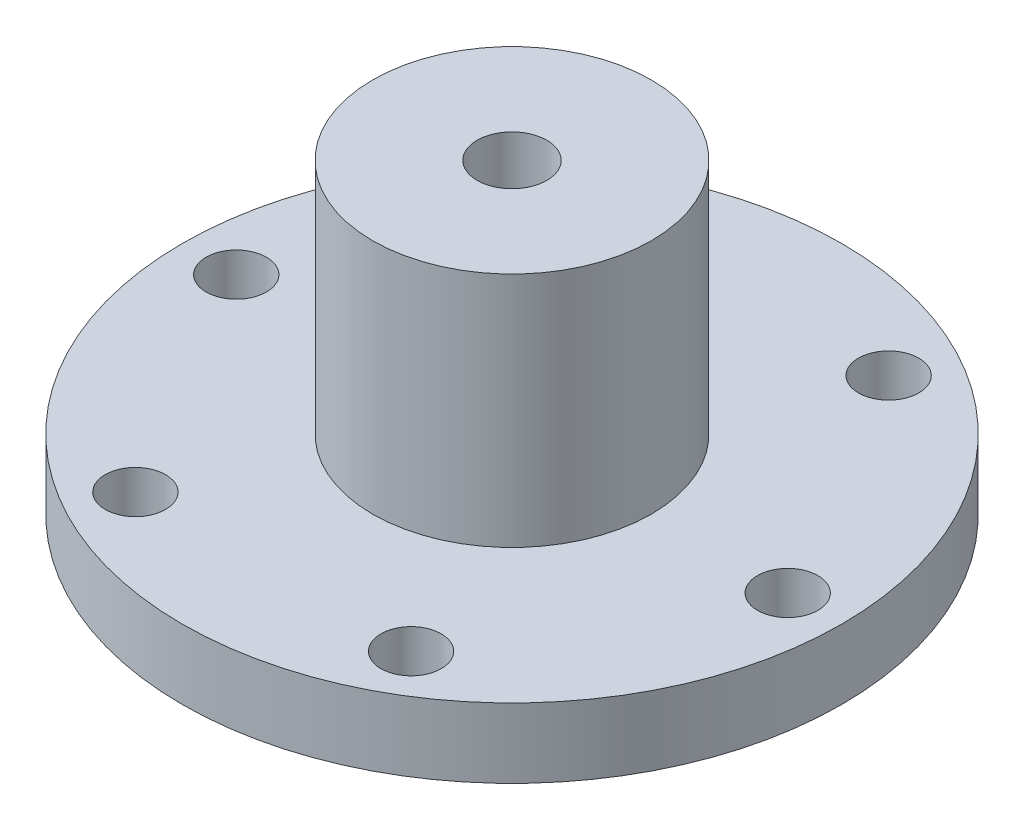
ISO-10303-21;
HEADER;
FILE_DESCRIPTION(('STEP AP214'),'2;1');
FILE_NAME('part.step','',(''),(''),'','','');
FILE_SCHEMA(('AUTOMOTIVE_DESIGN { 1 0 10303 214 1 1 1 1 }'));
ENDSEC;
DATA;
#1=APPLICATION_CONTEXT('core data for automotive mechanical design processes');
#2=APPLICATION_PROTOCOL_DEFINITION('international standard','automotive_design',2000,#1);
#3=PRODUCT_CONTEXT('',#1,'mechanical');
#4=PRODUCT('Part','Part','',(#3));
#5=PRODUCT_RELATED_PRODUCT_CATEGORY('part','',(#4));
#6=PRODUCT_DEFINITION_FORMATION('','',#4);
#7=PRODUCT_DEFINITION_CONTEXT('part definition',#1,'design');
#8=PRODUCT_DEFINITION('design','',#6,#7);
#9=PRODUCT_DEFINITION_SHAPE('','',#8);
#10=(LENGTH_UNIT() NAMED_UNIT(*) SI_UNIT(.MILLI.,.METRE.));
#11=(NAMED_UNIT(*) PLANE_ANGLE_UNIT() SI_UNIT($,.RADIAN.));
#12=(NAMED_UNIT(*) SI_UNIT($,.STERADIAN.) SOLID_ANGLE_UNIT());
#13=UNCERTAINTY_MEASURE_WITH_UNIT(LENGTH_MEASURE(1.E-05),#10,'distance_accuracy_value','');
#14=(GEOMETRIC_REPRESENTATION_CONTEXT(3) GLOBAL_UNCERTAINTY_ASSIGNED_CONTEXT((#13)) GLOBAL_UNIT_ASSIGNED_CONTEXT((#10,
#11,#12)) REPRESENTATION_CONTEXT('',''));
#15=CARTESIAN_POINT('',(0.,0.,0.));
#16=DIRECTION('',(0.,0.,1.));
#17=DIRECTION('',(1.,0.,0.));
#18=AXIS2_PLACEMENT_3D('',#15,#16,#17);
#19=CARTESIAN_POINT('',(0.,6.,0.));
#20=DIRECTION('',(0.,-1.,0.));
#21=DIRECTION('',(0.,0.,-1.));
#22=AXIS2_PLACEMENT_3D('',#19,#20,#21);
#23=CYLINDRICAL_SURFACE('',#22,28.399999969);
#24=CARTESIAN_POINT('',(0.,6.,0.));
#25=DIRECTION('',(0.,1.,0.));
#26=DIRECTION('',(0.,0.,1.));
#27=AXIS2_PLACEMENT_3D('',#24,#25,#26);
#28=CIRCLE('',#27,28.399999969);
#29=CARTESIAN_POINT('',(0.,6.,28.399999969));
#30=VERTEX_POINT('',#29);
#31=EDGE_CURVE('E10',#30,#30,#28,.T.);
#32=ORIENTED_EDGE('',*,*,#31,.F.);
#33=EDGE_LOOP('',(#32));
#34=FACE_BOUND('',#33,.T.);
#35=CARTESIAN_POINT('',(0.,0.,0.));
#36=DIRECTION('',(0.,1.,0.));
#37=DIRECTION('',(0.,0.,1.));
#38=AXIS2_PLACEMENT_3D('',#35,#36,#37);
#39=CIRCLE('',#38,28.399999969);
#40=CARTESIAN_POINT('',(0.,0.,28.399999969));
#41=VERTEX_POINT('',#40);
#42=EDGE_CURVE('E44',#41,#41,#39,.T.);
#43=ORIENTED_EDGE('',*,*,#42,.T.);
#44=EDGE_LOOP('',(#43));
#45=FACE_BOUND('',#44,.T.);
#46=ADVANCED_FACE('F33',(#34,#45),#23,.T.);
#47=CARTESIAN_POINT('',(0.,6.,0.));
#48=DIRECTION('',(0.,1.,0.));
#49=DIRECTION('',(0.,0.,1.));
#50=AXIS2_PLACEMENT_3D('',#47,#48,#49);
#51=PLANE('',#50);
#52=CARTESIAN_POINT('',(11.8750000000002,6.,-20.5681033398803));
#53=DIRECTION('',(0.,1.,0.));
#54=DIRECTION('',(0.,0.,1.));
#55=AXIS2_PLACEMENT_3D('',#52,#53,#54);
#56=CIRCLE('',#55,2.6);
#57=CARTESIAN_POINT('',(11.8750000000002,6.,-17.9681033398803));
#58=VERTEX_POINT('',#57);
#59=EDGE_CURVE('E93',#58,#58,#56,.T.);
#60=ORIENTED_EDGE('',*,*,#59,.F.);
#61=EDGE_LOOP('',(#60));
#62=FACE_BOUND('',#61,.T.);
#63=CARTESIAN_POINT('',(-11.8749999999998,6.,-20.5681033398805));
#64=DIRECTION('',(0.,1.,0.));
#65=DIRECTION('',(0.,0.,1.));
#66=AXIS2_PLACEMENT_3D('',#63,#64,#65);
#67=CIRCLE('',#66,2.6);
#68=CARTESIAN_POINT('',(-11.8749999999998,6.,-17.9681033398805));
#69=VERTEX_POINT('',#68);
#70=EDGE_CURVE('E87',#69,#69,#67,.T.);
#71=ORIENTED_EDGE('',*,*,#70,.F.);
#72=EDGE_LOOP('',(#71));
#73=FACE_BOUND('',#72,.T.);
#74=CARTESIAN_POINT('',(-23.75,6.,-1.65845363595049E-13));
#75=DIRECTION('',(0.,1.,0.));
#76=DIRECTION('',(0.,0.,1.));
#77=AXIS2_PLACEMENT_3D('',#74,#75,#76);
#78=CIRCLE('',#77,2.6);
#79=CARTESIAN_POINT('',(-23.75,6.,2.59999999999984));
#80=VERTEX_POINT('',#79);
#81=EDGE_CURVE('E81',#80,#80,#78,.T.);
#82=ORIENTED_EDGE('',*,*,#81,.F.);
#83=EDGE_LOOP('',(#82));
#84=FACE_BOUND('',#83,.T.);
#85=CARTESIAN_POINT('',(-11.8750000000001,6.,20.5681033398804));
#86=DIRECTION('',(0.,1.,0.));
#87=DIRECTION('',(0.,0.,1.));
#88=AXIS2_PLACEMENT_3D('',#85,#86,#87);
#89=CIRCLE('',#88,2.6);
#90=CARTESIAN_POINT('',(-11.8750000000001,6.,23.1681033398804));
#91=VERTEX_POINT('',#90);
#92=EDGE_CURVE('E75',#91,#91,#89,.T.);
#93=ORIENTED_EDGE('',*,*,#92,.F.);
#94=EDGE_LOOP('',(#93));
#95=FACE_BOUND('',#94,.T.);
#96=CARTESIAN_POINT('',(11.875,6.,20.5681033398804));
#97=DIRECTION('',(0.,1.,0.));
#98=DIRECTION('',(0.,0.,1.));
#99=AXIS2_PLACEMENT_3D('',#96,#97,#98);
#100=CIRCLE('',#99,2.6);
#101=CARTESIAN_POINT('',(11.875,6.,23.1681033398804));
#102=VERTEX_POINT('',#101);
#103=EDGE_CURVE('E69',#102,#102,#100,.T.);
#104=ORIENTED_EDGE('',*,*,#103,.F.);
#105=EDGE_LOOP('',(#104));
#106=FACE_BOUND('',#105,.T.);
#107=CARTESIAN_POINT('',(23.75,6.,0.));
#108=DIRECTION('',(0.,1.,0.));
#109=DIRECTION('',(0.,0.,1.));
#110=AXIS2_PLACEMENT_3D('',#107,#108,#109);
#111=CIRCLE('',#110,2.6);
#112=CARTESIAN_POINT('',(23.75,6.,2.6));
#113=VERTEX_POINT('',#112);
#114=EDGE_CURVE('E63',#113,#113,#111,.T.);
#115=ORIENTED_EDGE('',*,*,#114,.F.);
#116=EDGE_LOOP('',(#115));
#117=FACE_BOUND('',#116,.T.);
#118=CARTESIAN_POINT('',(0.,6.,0.));
#119=DIRECTION('',(0.,1.,0.));
#120=DIRECTION('',(0.,0.,1.));
#121=AXIS2_PLACEMENT_3D('',#118,#119,#120);
#122=CIRCLE('',#121,12.);
#123=CARTESIAN_POINT('',(0.,6.,12.));
#124=VERTEX_POINT('',#123);
#125=EDGE_CURVE('E51',#124,#124,#122,.T.);
#126=ORIENTED_EDGE('',*,*,#125,.F.);
#127=EDGE_LOOP('',(#126));
#128=FACE_BOUND('',#127,.T.);
#129=ORIENTED_EDGE('',*,*,#31,.T.);
#130=EDGE_LOOP('',(#129));
#131=FACE_BOUND('',#130,.T.);
#132=ADVANCED_FACE('F151',(#62,#73,#84,#95,#106,#117,#128,#131),#51,.T.);
#133=CARTESIAN_POINT('',(0.,0.,0.));
#134=DIRECTION('',(0.,1.,0.));
#135=DIRECTION('',(0.,0.,1.));
#136=AXIS2_PLACEMENT_3D('',#133,#134,#135);
#137=PLANE('',#136);
#138=CARTESIAN_POINT('',(11.8750000000002,0.,-20.5681033398803));
#139=DIRECTION('',(0.,1.,0.));
#140=DIRECTION('',(0.,0.,1.));
#141=AXIS2_PLACEMENT_3D('',#138,#139,#140);
#142=CIRCLE('',#141,2.6);
#143=CARTESIAN_POINT('',(11.8750000000002,0.,-17.9681033398803));
#144=VERTEX_POINT('',#143);
#145=EDGE_CURVE('E90',#144,#144,#142,.T.);
#146=ORIENTED_EDGE('',*,*,#145,.T.);
#147=EDGE_LOOP('',(#146));
#148=FACE_BOUND('',#147,.T.);
#149=CARTESIAN_POINT('',(-11.8749999999998,0.,-20.5681033398805));
#150=DIRECTION('',(0.,1.,0.));
#151=DIRECTION('',(0.,0.,1.));
#152=AXIS2_PLACEMENT_3D('',#149,#150,#151);
#153=CIRCLE('',#152,2.6);
#154=CARTESIAN_POINT('',(-11.8749999999998,0.,-17.9681033398805));
#155=VERTEX_POINT('',#154);
#156=EDGE_CURVE('E84',#155,#155,#153,.T.);
#157=ORIENTED_EDGE('',*,*,#156,.T.);
#158=EDGE_LOOP('',(#157));
#159=FACE_BOUND('',#158,.T.);
#160=CARTESIAN_POINT('',(-23.75,0.,-1.65845363595049E-13));
#161=DIRECTION('',(0.,1.,0.));
#162=DIRECTION('',(0.,0.,1.));
#163=AXIS2_PLACEMENT_3D('',#160,#161,#162);
#164=CIRCLE('',#163,2.6);
#165=CARTESIAN_POINT('',(-23.75,0.,2.59999999999984));
#166=VERTEX_POINT('',#165);
#167=EDGE_CURVE('E78',#166,#166,#164,.T.);
#168=ORIENTED_EDGE('',*,*,#167,.T.);
#169=EDGE_LOOP('',(#168));
#170=FACE_BOUND('',#169,.T.);
#171=CARTESIAN_POINT('',(-11.8750000000001,0.,20.5681033398804));
#172=DIRECTION('',(0.,1.,0.));
#173=DIRECTION('',(0.,0.,1.));
#174=AXIS2_PLACEMENT_3D('',#171,#172,#173);
#175=CIRCLE('',#174,2.6);
#176=CARTESIAN_POINT('',(-11.8750000000001,0.,23.1681033398804));
#177=VERTEX_POINT('',#176);
#178=EDGE_CURVE('E72',#177,#177,#175,.T.);
#179=ORIENTED_EDGE('',*,*,#178,.T.);
#180=EDGE_LOOP('',(#179));
#181=FACE_BOUND('',#180,.T.);
#182=CARTESIAN_POINT('',(11.875,0.,20.5681033398804));
#183=DIRECTION('',(0.,1.,0.));
#184=DIRECTION('',(0.,0.,1.));
#185=AXIS2_PLACEMENT_3D('',#182,#183,#184);
#186=CIRCLE('',#185,2.6);
#187=CARTESIAN_POINT('',(11.875,0.,23.1681033398804));
#188=VERTEX_POINT('',#187);
#189=EDGE_CURVE('E66',#188,#188,#186,.T.);
#190=ORIENTED_EDGE('',*,*,#189,.T.);
#191=EDGE_LOOP('',(#190));
#192=FACE_BOUND('',#191,.T.);
#193=CARTESIAN_POINT('',(23.75,0.,0.));
#194=DIRECTION('',(0.,1.,0.));
#195=DIRECTION('',(0.,0.,1.));
#196=AXIS2_PLACEMENT_3D('',#193,#194,#195);
#197=CIRCLE('',#196,2.6);
#198=CARTESIAN_POINT('',(23.75,0.,2.6));
#199=VERTEX_POINT('',#198);
#200=EDGE_CURVE('E60',#199,#199,#197,.T.);
#201=ORIENTED_EDGE('',*,*,#200,.T.);
#202=EDGE_LOOP('',(#201));
#203=FACE_BOUND('',#202,.T.);
#204=CARTESIAN_POINT('',(0.,0.,0.));
#205=DIRECTION('',(0.,1.,0.));
#206=DIRECTION('',(0.,0.,1.));
#207=AXIS2_PLACEMENT_3D('',#204,#205,#206);
#208=CIRCLE('',#207,3.);
#209=CARTESIAN_POINT('',(0.,0.,3.));
#210=VERTEX_POINT('',#209);
#211=EDGE_CURVE('E54',#210,#210,#208,.T.);
#212=ORIENTED_EDGE('',*,*,#211,.T.);
#213=EDGE_LOOP('',(#212));
#214=FACE_BOUND('',#213,.T.);
#215=ORIENTED_EDGE('',*,*,#42,.F.);
#216=EDGE_LOOP('',(#215));
#217=FACE_BOUND('',#216,.T.);
#218=ADVANCED_FACE('F146',(#148,#159,#170,#181,#192,#203,#214,#217),#137,.F.);
#219=CARTESIAN_POINT('',(0.,26.4,0.));
#220=DIRECTION('',(0.,-1.,0.));
#221=DIRECTION('',(0.,0.,-1.));
#222=AXIS2_PLACEMENT_3D('',#219,#220,#221);
#223=CYLINDRICAL_SURFACE('',#222,12.);
#224=CARTESIAN_POINT('',(-11.8860212013945,16.2,-1.65));
#225=CARTESIAN_POINT('',(-11.8860226385264,16.2922099836039,-1.64999613002397));
#226=CARTESIAN_POINT('',(-11.887105826869,16.3844756424036,-1.64224418013213));
#227=CARTESIAN_POINT('',(-11.8913192881957,16.5664335268034,-1.61144589625373));
#228=CARTESIAN_POINT('',(-11.8944516322165,16.6561230529258,-1.58838408858117));
#229=CARTESIAN_POINT('',(-11.9024020662651,16.8302681965866,-1.52766373861284));
#230=CARTESIAN_POINT('',(-11.907218940567,16.9147275371465,-1.49001572108042));
#231=CARTESIAN_POINT('',(-11.9179942416571,17.0761160044999,-1.40121530144306));
#232=CARTESIAN_POINT('',(-11.9239524914714,17.1530462959071,-1.35006499244905));
#233=CARTESIAN_POINT('',(-11.9363841732149,17.2977257656313,-1.23534295463377));
#234=CARTESIAN_POINT('',(-11.9428604946832,17.3654167928301,-1.17169819415429));
#235=CARTESIAN_POINT('',(-11.9555727153941,17.4891931337131,-1.03395139464466));
#236=CARTESIAN_POINT('',(-11.9618086020727,17.545277841574,-0.959848810079498));
#237=CARTESIAN_POINT('',(-11.9733672599732,17.6444611527789,-0.802920736856228));
#238=CARTESIAN_POINT('',(-11.9786862604444,17.687506656062,-0.720061385959914));
#239=CARTESIAN_POINT('',(-11.987779954729,17.7590492420904,-0.548204027714128));
#240=CARTESIAN_POINT('',(-11.9915547174138,17.787546973665,-0.459206294336957));
#241=CARTESIAN_POINT('',(-11.9971142530275,17.8290100274017,-0.27819549981178));
#242=CARTESIAN_POINT('',(-11.9989114564869,17.8420724118091,-0.18620506005694));
#243=CARTESIAN_POINT('',(-12.0003559025848,17.8525950633701,-0.00132154623841455));
#244=CARTESIAN_POINT('',(-12.0000032465168,17.850056065604,0.091571485092546));
#245=CARTESIAN_POINT('',(-11.9971977051282,17.8295252428477,0.274962034432949));
#246=CARTESIAN_POINT('',(-11.9947590099541,17.8116378219599,0.365471488379662));
#247=CARTESIAN_POINT('',(-11.9880712548747,17.7610814392378,0.542191714384656));
#248=CARTESIAN_POINT('',(-11.983822154588,17.7284121476899,0.628402390509935));
#249=CARTESIAN_POINT('',(-11.9739665629351,17.6491103463231,0.794397626155873));
#250=CARTESIAN_POINT('',(-11.9683557477435,17.6024332438367,0.874160615027393));
#251=CARTESIAN_POINT('',(-11.9564033222874,17.4964733042003,1.02476103819425));
#252=CARTESIAN_POINT('',(-11.9500616715262,17.4371897683543,1.0955979774276));
#253=CARTESIAN_POINT('',(-11.9372942289596,17.3071165331883,1.22694987666086));
#254=CARTESIAN_POINT('',(-11.930868174974,17.236235761787,1.28737466116175));
#255=CARTESIAN_POINT('',(-11.9187076339264,17.0852913021618,1.39548458645317));
#256=CARTESIAN_POINT('',(-11.912973149937,17.0052275731421,1.44316967064364));
#257=CARTESIAN_POINT('',(-11.9028451928452,16.8381030639792,1.52445508226451));
#258=CARTESIAN_POINT('',(-11.8984525006596,16.7510382463249,1.5580472118891));
#259=CARTESIAN_POINT('',(-11.8915200104002,16.5724291661169,1.61010807759645));
#260=CARTESIAN_POINT('',(-11.8889801034827,16.4808851670341,1.62857770207285));
#261=CARTESIAN_POINT('',(-11.8860610470463,16.2967155517176,1.6497478259494));
#262=CARTESIAN_POINT('',(-11.8856644486651,16.2041048402285,1.65257567090291));
#263=CARTESIAN_POINT('',(-11.8870306837085,16.0197309243631,1.64271887771973));
#264=CARTESIAN_POINT('',(-11.8887934611475,15.9279676980764,1.63003464176129));
#265=CARTESIAN_POINT('',(-11.8942638562767,15.7482813424197,1.58962134728677));
#266=CARTESIAN_POINT('',(-11.8979633908859,15.6603438859014,1.56195480124171));
#267=CARTESIAN_POINT('',(-11.9068838545356,15.4903553625703,1.4924269090734));
#268=CARTESIAN_POINT('',(-11.9121048475191,15.4083045433385,1.45056496634196));
#269=CARTESIAN_POINT('',(-11.9235214287447,15.2518447904077,1.353524903897));
#270=CARTESIAN_POINT('',(-11.9297230041887,15.1774877776703,1.29826378711661));
#271=CARTESIAN_POINT('',(-11.9423835691542,15.0390580220016,1.17611042773873));
#272=CARTESIAN_POINT('',(-11.9488425708334,14.9749857655103,1.10921763530709));
#273=CARTESIAN_POINT('',(-11.9613442783418,14.8584921806098,0.965141289202763));
#274=CARTESIAN_POINT('',(-11.9673837807676,14.8061548754327,0.887889479841927));
#275=CARTESIAN_POINT('',(-11.9783172297318,14.7152001514837,0.725616987133672));
#276=CARTESIAN_POINT('',(-11.9832112034072,14.6765824076898,0.640596487889617));
#277=CARTESIAN_POINT('',(-11.9912880512405,14.6142996334912,0.465471145143462));
#278=CARTESIAN_POINT('',(-11.9944763336247,14.5905873002326,0.375383384604888));
#279=CARTESIAN_POINT('',(-11.9988051451922,14.5586349280938,0.19245803631145));
#280=CARTESIAN_POINT('',(-11.9999457871387,14.5503940372039,0.0996206002667852));
#281=CARTESIAN_POINT('',(-12.000049982485,14.5496367273189,-0.0853510273687197));
#282=CARTESIAN_POINT('',(-11.9990314067068,14.5569912327803,-0.177484706783055));
#283=CARTESIAN_POINT('',(-11.9949673702624,14.5869409993665,-0.359192748630849));
#284=CARTESIAN_POINT('',(-11.9919219132435,14.6095362330666,-0.448767115669332));
#285=CARTESIAN_POINT('',(-11.9841446870878,14.6692829599282,-0.622788002618768));
#286=CARTESIAN_POINT('',(-11.979413788575,14.7064269388385,-0.707237143683861));
#287=CARTESIAN_POINT('',(-11.9687875035311,14.7942032807651,-0.868724428360408));
#288=CARTESIAN_POINT('',(-11.9628920915401,14.8448359386944,-0.945762409886029));
#289=CARTESIAN_POINT('',(-11.9505354189161,14.9586249497664,-1.09089788838675));
#290=CARTESIAN_POINT('',(-11.9440700575623,15.0218770416567,-1.15891998091522));
#291=CARTESIAN_POINT('',(-11.9313338541327,15.1589086962648,-1.28343299501048));
#292=CARTESIAN_POINT('',(-11.9250630582485,15.2326907359522,-1.33992119582806));
#293=CARTESIAN_POINT('',(-11.9133946284749,15.3890896593099,-1.43999521477329));
#294=CARTESIAN_POINT('',(-11.9080012190855,15.4717462806581,-1.48351940161872));
#295=CARTESIAN_POINT('',(-11.8987476677121,15.6432274377896,-1.55600481854412));
#296=CARTESIAN_POINT('',(-11.8948858954033,15.7320452963508,-1.58498154220332));
#297=CARTESIAN_POINT('',(-11.8900489693475,15.8844123634655,-1.62078358790418));
#298=CARTESIAN_POINT('',(-11.8885463079709,15.947009514167,-1.63172351209083));
#299=CARTESIAN_POINT('',(-11.8865319342371,16.0730623196014,-1.64633301403956));
#300=CARTESIAN_POINT('',(-11.886020212,16.1365179657686,-1.65000266428798));
#301=CARTESIAN_POINT('',(-11.8860212013945,16.2,-1.65));
#302=B_SPLINE_CURVE_WITH_KNOTS('',3,(#224,#225,#226,#227,#228,#229,#230,#231,#232,#233,#234,
#235,#236,#237,#238,#239,#240,#241,#242,#243,#244,#245,#246,#247,#248,#249,#250,#251,#252,#253,
#254,#255,#256,#257,#258,#259,#260,#261,#262,#263,#264,#265,#266,#267,#268,#269,#270,#271,#272,
#273,#274,#275,#276,#277,#278,#279,#280,#281,#282,#283,#284,#285,#286,#287,#288,#289,#290,#291,
#292,#293,#294,#295,#296,#297,#298,#299,#300,#301),.UNSPECIFIED.,.T.,.F.,(4,2,2,2,2,2,2,2,2,2,2,
2,2,2,2,2,2,2,2,2,2,2,2,2,2,2,2,2,2,2,2,2,2,2,2,2,2,2,4),(0.,0.276397983484168,
0.553075748814355,0.829554246407602,1.10598990974026,1.38409225456223,1.66220911202883,
1.94144378337033,2.22066599978221,2.49812287504172,2.77556667764455,3.05113805998519,
3.32671558932153,3.60317987382279,3.8796594850114,4.15842481249814,4.43719137846516,
4.71611987755507,4.9950319894073,5.27166999415777,5.54830082672887,5.82378623413366,
6.09928322115331,6.3765323578066,6.65379460370645,6.9329828147985,7.21216441136923,
7.49045548174753,7.76873122623278,8.04471281054494,8.32069389824659,8.59653263261115,
8.87237739833847,9.15040043279803,9.42848897500463,9.70787919735418,9.98697122429637,
10.1772595261339,10.367545930743),.UNSPECIFIED.);
#303=CARTESIAN_POINT('',(-11.8860212013945,16.2,-1.65));
#304=VERTEX_POINT('',#303);
#305=EDGE_CURVE('E96',#304,#304,#302,.T.);
#306=ORIENTED_EDGE('',*,*,#305,.T.);
#307=EDGE_LOOP('',(#306));
#308=FACE_BOUND('',#307,.T.);
#309=CARTESIAN_POINT('',(0.,26.4,0.));
#310=DIRECTION('',(0.,1.,0.));
#311=DIRECTION('',(0.,0.,1.));
#312=AXIS2_PLACEMENT_3D('',#309,#310,#311);
#313=CIRCLE('',#312,12.);
#314=CARTESIAN_POINT('',(0.,26.4,12.));
#315=VERTEX_POINT('',#314);
#316=EDGE_CURVE('E49',#315,#315,#313,.T.);
#317=ORIENTED_EDGE('',*,*,#316,.F.);
#318=EDGE_LOOP('',(#317));
#319=FACE_BOUND('',#318,.T.);
#320=ORIENTED_EDGE('',*,*,#125,.T.);
#321=EDGE_LOOP('',(#320));
#322=FACE_BOUND('',#321,.T.);
#323=ADVANCED_FACE('F103',(#308,#319,#322),#223,.T.);
#324=CARTESIAN_POINT('',(0.,26.4,0.));
#325=DIRECTION('',(0.,1.,0.));
#326=DIRECTION('',(0.,0.,1.));
#327=AXIS2_PLACEMENT_3D('',#324,#325,#326);
#328=PLANE('',#327);
#329=CARTESIAN_POINT('',(0.,26.4,0.));
#330=DIRECTION('',(0.,1.,0.));
#331=DIRECTION('',(0.,0.,1.));
#332=AXIS2_PLACEMENT_3D('',#329,#330,#331);
#333=CIRCLE('',#332,3.);
#334=CARTESIAN_POINT('',(0.,26.4,3.));
#335=VERTEX_POINT('',#334);
#336=EDGE_CURVE('E57',#335,#335,#333,.T.);
#337=ORIENTED_EDGE('',*,*,#336,.F.);
#338=EDGE_LOOP('',(#337));
#339=FACE_BOUND('',#338,.T.);
#340=ORIENTED_EDGE('',*,*,#316,.T.);
#341=EDGE_LOOP('',(#340));
#342=FACE_BOUND('',#341,.T.);
#343=ADVANCED_FACE('F139',(#339,#342),#328,.T.);
#344=CARTESIAN_POINT('',(0.,0.,0.));
#345=DIRECTION('',(0.,1.,0.));
#346=DIRECTION('',(0.,0.,1.));
#347=AXIS2_PLACEMENT_3D('',#344,#345,#346);
#348=CYLINDRICAL_SURFACE('',#347,3.);
#349=CARTESIAN_POINT('',(-2.50549396327351,16.2,-1.65));
#350=CARTESIAN_POINT('',(-2.50550290729145,16.1154377558758,-1.64999358115515));
#351=CARTESIAN_POINT('',(-2.50984278304633,16.0308015803563,-1.64345412095508));
#352=CARTESIAN_POINT('',(-2.52652305472093,15.8642419893439,-1.61768357796129));
#353=CARTESIAN_POINT('',(-2.5388769381334,15.7823233922629,-1.59843109830519));
#354=CARTESIAN_POINT('',(-2.56969514424061,15.6239418416583,-1.54839133504121));
#355=CARTESIAN_POINT('',(-2.58812128253768,15.5474483363602,-1.51767597794515));
#356=CARTESIAN_POINT('',(-2.62894573960704,15.4007292506767,-1.44580368027316));
#357=CARTESIAN_POINT('',(-2.65134488586739,15.3305049806212,-1.40464456372702));
#358=CARTESIAN_POINT('',(-2.70034227169485,15.1905069795139,-1.30818987552103));
#359=CARTESIAN_POINT('',(-2.72713610292843,15.1214961430796,-1.25188597568528));
#360=CARTESIAN_POINT('',(-2.7803340212233,14.9932845752438,-1.12882249865068));
#361=CARTESIAN_POINT('',(-2.8067378662503,14.9340897205544,-1.06205670422282));
#362=CARTESIAN_POINT('',(-2.85888255333956,14.822187212475,-0.912984038802339));
#363=CARTESIAN_POINT('',(-2.88437182872328,14.7704729108744,-0.82983500932625));
#364=CARTESIAN_POINT('',(-2.9291637746478,14.6821220938197,-0.65434955639789));
#365=CARTESIAN_POINT('',(-2.94847115688416,14.6454740891042,-0.562020200659681));
#366=CARTESIAN_POINT('',(-2.97729382330391,14.5915060152004,-0.378922854343168));
#367=CARTESIAN_POINT('',(-2.98749000620555,14.572831856728,-0.288663762188305));
#368=CARTESIAN_POINT('',(-2.99953120217528,14.5508252216481,-0.105768848971922));
#369=CARTESIAN_POINT('',(-3.00138254652496,14.5474811140014,-0.0131348834272852));
#370=CARTESIAN_POINT('',(-2.99679126383707,14.5558401237369,0.16145694274338));
#371=CARTESIAN_POINT('',(-2.99119680588262,14.566004301038,0.243517036042418));
#372=CARTESIAN_POINT('',(-2.97370139090637,14.5982561393333,0.40454893471368));
#373=CARTESIAN_POINT('',(-2.96179994958743,14.6203447159739,0.483520502425808));
#374=CARTESIAN_POINT('',(-2.93258792133284,14.6758175954501,0.637279429786407));
#375=CARTESIAN_POINT('',(-2.91522047737549,14.7093209512549,0.712012587065492));
#376=CARTESIAN_POINT('',(-2.87655421939416,14.7864314461422,0.854941741305338));
#377=CARTESIAN_POINT('',(-2.85525414826244,14.830041817185,0.92313563729812));
#378=CARTESIAN_POINT('',(-2.80791814382438,14.9314847500415,1.05891717191853));
#379=CARTESIAN_POINT('',(-2.78161920172535,14.9903439308726,1.12564617195586));
#380=CARTESIAN_POINT('',(-2.72855637999779,15.1179242054498,1.24879377983835));
#381=CARTESIAN_POINT('',(-2.70179204741387,15.1866554412585,1.30520164705459));
#382=CARTESIAN_POINT('',(-2.64816260741379,15.3392979542294,1.41104757147093));
#383=CARTESIAN_POINT('',(-2.62149493557528,15.4240121749765,1.45943898084593));
#384=CARTESIAN_POINT('',(-2.57442669454811,15.6020876587557,1.54096072440202));
#385=CARTESIAN_POINT('',(-2.55401888906632,15.6954387738951,1.57410870202277));
#386=CARTESIAN_POINT('',(-2.52428868885372,15.880382433914,1.621324807476));
#387=CARTESIAN_POINT('',(-2.51420388175754,15.9715077071812,1.63671808149072));
#388=CARTESIAN_POINT('',(-2.50421132283931,16.1555614326045,1.65197600548299));
#389=CARTESIAN_POINT('',(-2.50429193328554,16.2484877010052,1.65185841284551));
#390=CARTESIAN_POINT('',(-2.51381291635781,16.4189806967755,1.63731066997579));
#391=CARTESIAN_POINT('',(-2.52189118280773,16.4968167627882,1.6249632757909));
#392=CARTESIAN_POINT('',(-2.54430898316227,16.6490948427084,1.58963092545288));
#393=CARTESIAN_POINT('',(-2.55865126498177,16.7235353511972,1.56664130047228));
#394=CARTESIAN_POINT('',(-2.59264701052962,16.8705684143407,1.50974087534156));
#395=CARTESIAN_POINT('',(-2.61249886195853,16.942950820695,1.47541058671725));
#396=CARTESIAN_POINT('',(-2.65517525628181,17.081361532983,1.39715088074391));
#397=CARTESIAN_POINT('',(-2.67800126759515,17.1473866719826,1.35321671440463));
#398=CARTESIAN_POINT('',(-2.72838745980259,17.2821759828331,1.24890384728535));
#399=CARTESIAN_POINT('',(-2.75612471210543,17.3497166554536,1.18702256034847));
#400=CARTESIAN_POINT('',(-2.81021466477288,17.4739446345825,1.05259034248067));
#401=CARTESIAN_POINT('',(-2.83656654669951,17.5306255766059,0.98003319859337));
#402=CARTESIAN_POINT('',(-2.88655886174343,17.6341835647783,0.821591432017615));
#403=CARTESIAN_POINT('',(-2.90999476284886,17.6804198077817,0.73521836449538));
#404=CARTESIAN_POINT('',(-2.94980224898629,17.7572143053759,0.554269536180259));
#405=CARTESIAN_POINT('',(-2.96618117604292,17.7877888605615,0.459702424085389));
#406=CARTESIAN_POINT('',(-2.98862325067975,17.8293061183918,0.275417797995453));
#407=CARTESIAN_POINT('',(-2.99556705432428,17.8419309693443,0.186187129425334));
#408=CARTESIAN_POINT('',(-3.00133436858647,17.8524318934345,0.00661676308886259));
#409=CARTESIAN_POINT('',(-3.00016215675142,17.8503157358196,-0.0837223254250954));
#410=CARTESIAN_POINT('',(-2.99031042427524,17.8323300715381,-0.254358366297033));
#411=CARTESIAN_POINT('',(-2.98231104671828,17.8177063332057,-0.334831363047835));
#412=CARTESIAN_POINT('',(-2.96044701025379,17.7770351780095,-0.49198583387688));
#413=CARTESIAN_POINT('',(-2.94658165149358,17.7509863980447,-0.568666854326149));
#414=CARTESIAN_POINT('',(-2.91359875185443,17.6873873679604,-0.719080279481093));
#415=CARTESIAN_POINT('',(-2.89431787940932,17.649474405955,-0.792622296205403));
#416=CARTESIAN_POINT('',(-2.85231650614788,17.5636744985123,-0.932542405269454));
#417=CARTESIAN_POINT('',(-2.82959461529654,17.5157835194005,-0.998917583844719));
#418=CARTESIAN_POINT('',(-2.77974517125015,17.4050739983496,-1.13072210629174));
#419=CARTESIAN_POINT('',(-2.75241145940814,17.3411721662743,-1.19516495605846));
#420=CARTESIAN_POINT('',(-2.69823878537054,17.2034928624481,-1.31290440702821));
#421=CARTESIAN_POINT('',(-2.67140046184162,17.1297035347267,-1.36618742691371));
#422=CARTESIAN_POINT('',(-2.61945108088931,16.9682759999486,-1.46345962344263));
#423=CARTESIAN_POINT('',(-2.59457299089604,16.8800436014073,-1.50659692748028));
#424=CARTESIAN_POINT('',(-2.55252885584285,16.6958211995913,-1.57680093269354));
#425=CARTESIAN_POINT('',(-2.53533827536757,16.5998570471718,-1.60391885150154));
#426=CARTESIAN_POINT('',(-2.5176692541321,16.4521912169415,-1.6313948659609));
#427=CARTESIAN_POINT('',(-2.51313062613142,16.40212523584,-1.6383544404993));
#428=CARTESIAN_POINT('',(-2.50704033236465,16.3013816875925,-1.64765888075615));
#429=CARTESIAN_POINT('',(-2.50548860037558,16.2507041340309,-1.65000384878586));
#430=CARTESIAN_POINT('',(-2.50549396327351,16.2,-1.65));
#431=B_SPLINE_CURVE_WITH_KNOTS('',3,(#349,#350,#351,#352,#353,#354,#355,#356,#357,#358,#359,
#360,#361,#362,#363,#364,#365,#366,#367,#368,#369,#370,#371,#372,#373,#374,#375,#376,#377,#378,
#379,#380,#381,#382,#383,#384,#385,#386,#387,#388,#389,#390,#391,#392,#393,#394,#395,#396,#397,
#398,#399,#400,#401,#402,#403,#404,#405,#406,#407,#408,#409,#410,#411,#412,#413,#414,#415,#416,
#417,#418,#419,#420,#421,#422,#423,#424,#425,#426,#427,#428,#429,#430),.UNSPECIFIED.,.T.,.F.,(4,
2,2,2,2,2,2,2,2,2,2,2,2,2,2,2,2,2,2,2,2,2,2,2,2,2,2,2,2,2,2,2,2,2,2,2,2,2,2,2,4),(0.,
0.253471464978914,0.507370630471965,0.759702723718419,1.01208743389991,1.28998079678324,
1.5680399351238,1.8699728936492,2.17167517502776,2.44828286528196,2.72468065617498,
2.9721366309398,3.21961160997027,3.46975098230538,3.71997045333205,3.99717687977863,
4.27467015892956,4.57652503396566,4.87802964361061,5.15517475627462,5.43200258623579,
5.66859462056208,5.905290548121,6.15196333618108,6.39875837770523,6.68465599353131,
6.97072065421035,7.27125286686233,7.57147164850534,7.84111747203333,8.1106211895083,
8.35604451303954,8.60149712555499,8.85533990697406,9.10928550569674,9.39243346006448,
9.67592402360688,9.97823556729934,10.2795752459721,10.4315619419379,10.5835452681421),.UNSPECIFIED.);
#432=CARTESIAN_POINT('',(-2.50549396327351,16.2,-1.65));
#433=VERTEX_POINT('',#432);
#434=EDGE_CURVE('E36',#433,#433,#431,.T.);
#435=ORIENTED_EDGE('',*,*,#434,.T.);
#436=EDGE_LOOP('',(#435));
#437=FACE_BOUND('',#436,.T.);
#438=ORIENTED_EDGE('',*,*,#211,.F.);
#439=EDGE_LOOP('',(#438));
#440=FACE_BOUND('',#439,.T.);
#441=ORIENTED_EDGE('',*,*,#336,.T.);
#442=EDGE_LOOP('',(#441));
#443=FACE_BOUND('',#442,.T.);
#444=ADVANCED_FACE('F135',(#437,#440,#443),#348,.F.);
#445=CARTESIAN_POINT('',(23.75,0.,0.));
#446=DIRECTION('',(0.,1.,0.));
#447=DIRECTION('',(0.,0.,1.));
#448=AXIS2_PLACEMENT_3D('',#445,#446,#447);
#449=CYLINDRICAL_SURFACE('',#448,2.6);
#450=ORIENTED_EDGE('',*,*,#200,.F.);
#451=EDGE_LOOP('',(#450));
#452=FACE_BOUND('',#451,.T.);
#453=ORIENTED_EDGE('',*,*,#114,.T.);
#454=EDGE_LOOP('',(#453));
#455=FACE_BOUND('',#454,.T.);
#456=ADVANCED_FACE('F132',(#452,#455),#449,.F.);
#457=CARTESIAN_POINT('',(11.875,0.,20.5681033398804));
#458=DIRECTION('',(0.,1.,0.));
#459=DIRECTION('',(0.,0.,1.));
#460=AXIS2_PLACEMENT_3D('',#457,#458,#459);
#461=CYLINDRICAL_SURFACE('',#460,2.6);
#462=ORIENTED_EDGE('',*,*,#189,.F.);
#463=EDGE_LOOP('',(#462));
#464=FACE_BOUND('',#463,.T.);
#465=ORIENTED_EDGE('',*,*,#103,.T.);
#466=EDGE_LOOP('',(#465));
#467=FACE_BOUND('',#466,.T.);
#468=ADVANCED_FACE('F128',(#464,#467),#461,.F.);
#469=CARTESIAN_POINT('',(-11.8750000000001,0.,20.5681033398804));
#470=DIRECTION('',(0.,1.,0.));
#471=DIRECTION('',(0.,0.,1.));
#472=AXIS2_PLACEMENT_3D('',#469,#470,#471);
#473=CYLINDRICAL_SURFACE('',#472,2.6);
#474=ORIENTED_EDGE('',*,*,#178,.F.);
#475=EDGE_LOOP('',(#474));
#476=FACE_BOUND('',#475,.T.);
#477=ORIENTED_EDGE('',*,*,#92,.T.);
#478=EDGE_LOOP('',(#477));
#479=FACE_BOUND('',#478,.T.);
#480=ADVANCED_FACE('F124',(#476,#479),#473,.F.);
#481=CARTESIAN_POINT('',(-23.75,0.,-1.65845363595049E-13));
#482=DIRECTION('',(0.,1.,0.));
#483=DIRECTION('',(0.,0.,1.));
#484=AXIS2_PLACEMENT_3D('',#481,#482,#483);
#485=CYLINDRICAL_SURFACE('',#484,2.6);
#486=ORIENTED_EDGE('',*,*,#167,.F.);
#487=EDGE_LOOP('',(#486));
#488=FACE_BOUND('',#487,.T.);
#489=ORIENTED_EDGE('',*,*,#81,.T.);
#490=EDGE_LOOP('',(#489));
#491=FACE_BOUND('',#490,.T.);
#492=ADVANCED_FACE('F120',(#488,#491),#485,.F.);
#493=CARTESIAN_POINT('',(-11.8749999999998,0.,-20.5681033398805));
#494=DIRECTION('',(0.,1.,0.));
#495=DIRECTION('',(0.,0.,1.));
#496=AXIS2_PLACEMENT_3D('',#493,#494,#495);
#497=CYLINDRICAL_SURFACE('',#496,2.6);
#498=ORIENTED_EDGE('',*,*,#156,.F.);
#499=EDGE_LOOP('',(#498));
#500=FACE_BOUND('',#499,.T.);
#501=ORIENTED_EDGE('',*,*,#70,.T.);
#502=EDGE_LOOP('',(#501));
#503=FACE_BOUND('',#502,.T.);
#504=ADVANCED_FACE('F116',(#500,#503),#497,.F.);
#505=CARTESIAN_POINT('',(11.8750000000002,0.,-20.5681033398803));
#506=DIRECTION('',(0.,1.,0.));
#507=DIRECTION('',(0.,0.,1.));
#508=AXIS2_PLACEMENT_3D('',#505,#506,#507);
#509=CYLINDRICAL_SURFACE('',#508,2.6);
#510=ORIENTED_EDGE('',*,*,#145,.F.);
#511=EDGE_LOOP('',(#510));
#512=FACE_BOUND('',#511,.T.);
#513=ORIENTED_EDGE('',*,*,#59,.T.);
#514=EDGE_LOOP('',(#513));
#515=FACE_BOUND('',#514,.T.);
#516=ADVANCED_FACE('F111',(#512,#515),#509,.F.);
#517=CARTESIAN_POINT('',(-28.399999969,16.2,0.));
#518=DIRECTION('',(1.,0.,0.));
#519=DIRECTION('',(0.,0.,-1.));
#520=AXIS2_PLACEMENT_3D('',#517,#518,#519);
#521=CYLINDRICAL_SURFACE('',#520,1.65);
#522=ORIENTED_EDGE('',*,*,#434,.F.);
#523=EDGE_LOOP('',(#522));
#524=FACE_BOUND('',#523,.T.);
#525=ORIENTED_EDGE('',*,*,#305,.F.);
#526=EDGE_LOOP('',(#525));
#527=FACE_BOUND('',#526,.T.);
#528=ADVANCED_FACE('F107',(#524,#527),#521,.F.);
#529=CLOSED_SHELL('',(#46,#132,#218,#323,#343,#444,#456,#468,#480,#492,#504,#516,#528));
#530=MANIFOLD_SOLID_BREP('B2',#529);
#531=ADVANCED_BREP_SHAPE_REPRESENTATION('',(#18,#530),#14);
#532=SHAPE_DEFINITION_REPRESENTATION(#9,#531);
ENDSEC;
END-ISO-10303-21;
